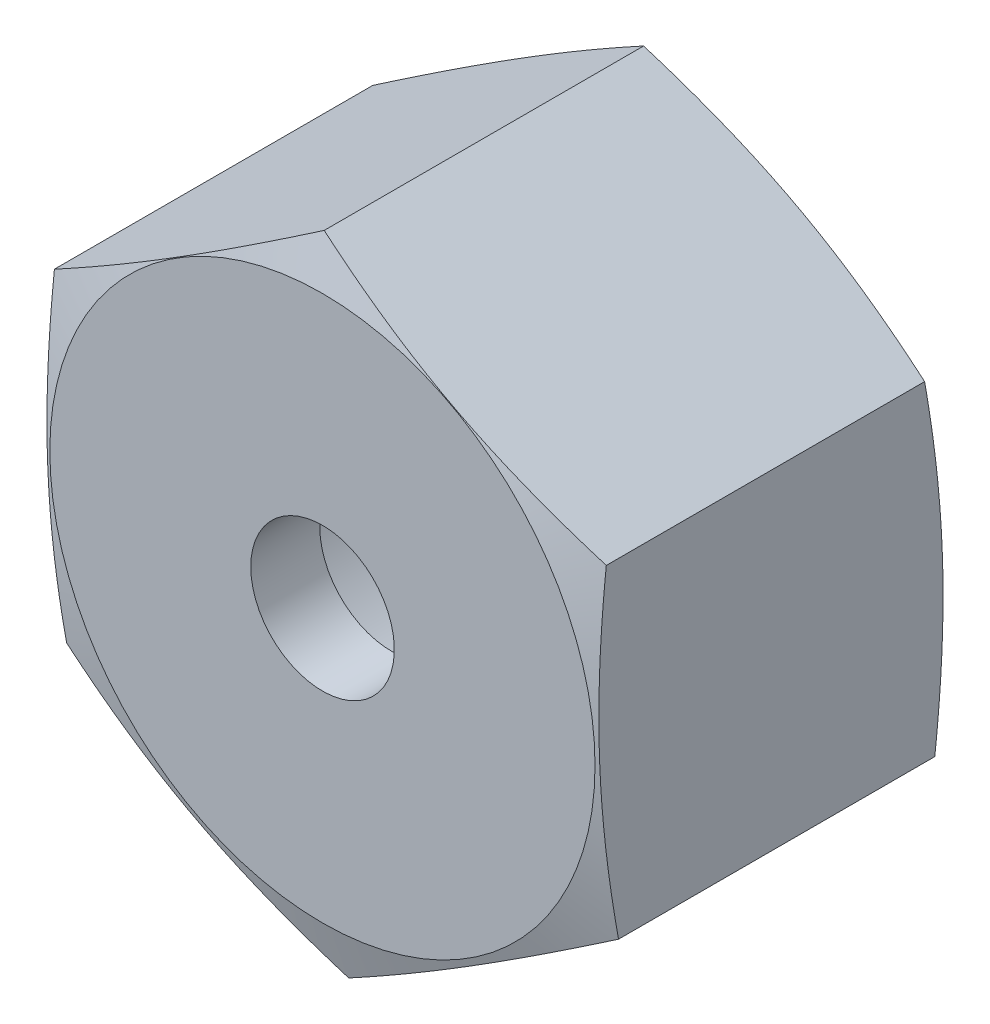
ISO-10303-21;
HEADER;
FILE_DESCRIPTION(('STEP AP214'),'2;1');
FILE_NAME('part.step','',(''),(''),'','','');
FILE_SCHEMA(('AUTOMOTIVE_DESIGN { 1 0 10303 214 1 1 1 1 }'));
ENDSEC;
DATA;
#1=APPLICATION_CONTEXT('core data for automotive mechanical design processes');
#2=APPLICATION_PROTOCOL_DEFINITION('international standard','automotive_design',2000,#1);
#3=PRODUCT_CONTEXT('',#1,'mechanical');
#4=PRODUCT('Part','Part','',(#3));
#5=PRODUCT_RELATED_PRODUCT_CATEGORY('part','',(#4));
#6=PRODUCT_DEFINITION_FORMATION('','',#4);
#7=PRODUCT_DEFINITION_CONTEXT('part definition',#1,'design');
#8=PRODUCT_DEFINITION('design','',#6,#7);
#9=PRODUCT_DEFINITION_SHAPE('','',#8);
#10=(LENGTH_UNIT() NAMED_UNIT(*) SI_UNIT(.MILLI.,.METRE.));
#11=(NAMED_UNIT(*) PLANE_ANGLE_UNIT() SI_UNIT($,.RADIAN.));
#12=(NAMED_UNIT(*) SI_UNIT($,.STERADIAN.) SOLID_ANGLE_UNIT());
#13=UNCERTAINTY_MEASURE_WITH_UNIT(LENGTH_MEASURE(1.E-05),#10,'distance_accuracy_value','');
#14=(GEOMETRIC_REPRESENTATION_CONTEXT(3) GLOBAL_UNCERTAINTY_ASSIGNED_CONTEXT((#13)) GLOBAL_UNIT_ASSIGNED_CONTEXT((#10,
#11,#12)) REPRESENTATION_CONTEXT('',''));
#15=CARTESIAN_POINT('',(0.,0.,0.));
#16=DIRECTION('',(0.,0.,1.));
#17=DIRECTION('',(1.,0.,0.));
#18=AXIS2_PLACEMENT_3D('',#15,#16,#17);
#19=CARTESIAN_POINT('',(-1.68437698196864,0.,-2.032));
#20=DIRECTION('',(0.,0.,1.));
#21=DIRECTION('',(1.,0.,0.));
#22=AXIS2_PLACEMENT_3D('',#19,#20,#21);
#23=PLANE('',#22);
#24=CARTESIAN_POINT('',(-1.68718582633648,0.0798447166311515,-2.03200000080983));
#25=DIRECTION('',(0.,0.,1.));
#26=DIRECTION('',(1.,0.,0.));
#27=AXIS2_PLACEMENT_3D('',#24,#25,#26);
#28=CIRCLE('',#27,6.26924252630839);
#29=CARTESIAN_POINT('',(4.58205669997191,0.0798447166311515,-2.03200000080983));
#30=VERTEX_POINT('',#29);
#31=EDGE_CURVE('E252',#30,#30,#28,.T.);
#32=ORIENTED_EDGE('',*,*,#31,.F.);
#33=EDGE_LOOP('',(#32));
#34=FACE_BOUND('',#33,.T.);
#35=CARTESIAN_POINT('',(-1.68437698196866,0.0799435285126994,-2.0319999999856));
#36=DIRECTION('',(0.,0.,-1.));
#37=DIRECTION('',(-1.,0.,0.));
#38=AXIS2_PLACEMENT_3D('',#35,#36,#37);
#39=CIRCLE('',#38,4.36562388905558);
#40=CARTESIAN_POINT('',(-6.05000087102424,0.0799435285126994,-2.0319999999856));
#41=VERTEX_POINT('',#40);
#42=EDGE_CURVE('E19',#41,#41,#39,.F.);
#43=ORIENTED_EDGE('',*,*,#42,.T.);
#44=EDGE_LOOP('',(#43));
#45=FACE_BOUND('',#44,.T.);
#46=ADVANCED_FACE('F16',(#34,#45),#23,.F.);
#47=CARTESIAN_POINT('',(-1.68437698196866,0.0799435285126994,-2.03199999987191));
#48=DIRECTION('',(0.,0.,-1.));
#49=DIRECTION('',(-1.,0.,0.));
#50=AXIS2_PLACEMENT_3D('',#47,#48,#49);
#51=CONICAL_SURFACE('',#50,4.36562388905204,0.0311192205274225);
#52=CARTESIAN_POINT('',(-1.68437698196866,0.0799435285126994,4.31800000001203));
#53=DIRECTION('',(0.,0.,-1.));
#54=DIRECTION('',(-1.,0.,0.));
#55=AXIS2_PLACEMENT_3D('',#52,#53,#54);
#56=CIRCLE('',#55,4.16795302604421);
#57=CARTESIAN_POINT('',(-5.85233000801287,0.0799435285126994,4.31800000001203));
#58=VERTEX_POINT('',#57);
#59=EDGE_CURVE('E78',#58,#58,#56,.F.);
#60=ORIENTED_EDGE('',*,*,#59,.T.);
#61=EDGE_LOOP('',(#60));
#62=FACE_BOUND('',#61,.T.);
#63=ORIENTED_EDGE('',*,*,#42,.F.);
#64=EDGE_LOOP('',(#63));
#65=FACE_BOUND('',#64,.T.);
#66=ADVANCED_FACE('F115',(#62,#65),#51,.F.);
#67=CARTESIAN_POINT('',(-1.68718582633648,0.0798447166311515,-1.68543793177971));
#68=DIRECTION('',(0.,0.,1.));
#69=DIRECTION('',(1.,0.,0.));
#70=AXIS2_PLACEMENT_3D('',#67,#68,#69);
#71=CONICAL_SURFACE('',#70,7.41910050189164,1.27805970982502);
#72=ORIENTED_EDGE('',*,*,#31,.T.);
#73=EDGE_LOOP('',(#72));
#74=FACE_BOUND('',#73,.T.);
#75=CARTESIAN_POINT('',(-7.90155935946617,-3.88715531238072,-1.6994469075203));
#76=CARTESIAN_POINT('',(-7.63283354902785,-4.02995052571652,-1.74457835599168));
#77=CARTESIAN_POINT('',(-7.36350025758161,-4.17306854161447,-1.78547486718036));
#78=CARTESIAN_POINT('',(-6.82365934852008,-4.45992858550493,-1.8571514041136));
#79=CARTESIAN_POINT('',(-6.55315121737776,-4.60367088637485,-1.88792643198343));
#80=CARTESIAN_POINT('',(-6.0129977336647,-4.8906970258256,-1.93750670168888));
#81=CARTESIAN_POINT('',(-5.74335791157891,-5.03397792562367,-1.95638716592702));
#82=CARTESIAN_POINT('',(-5.20367165362195,-5.32075579118734,-1.98130690017016));
#83=CARTESIAN_POINT('',(-4.9336253296936,-5.46425269746888,-1.98734922279734));
#84=CARTESIAN_POINT('',(-4.39357127680444,-5.75122600148232,-1.98618661366952));
#85=CARTESIAN_POINT('',(-4.12356354650853,-5.89470239992366,-1.97898245963108));
#86=CARTESIAN_POINT('',(-3.58399310901471,-6.18141872094228,-1.95181743046639));
#87=CARTESIAN_POINT('',(-3.31443052471405,-6.32465857821457,-1.93185348217872));
#88=CARTESIAN_POINT('',(-2.77445511938541,-6.61159009057738,-1.88023250615435));
#89=CARTESIAN_POINT('',(-2.50404799535492,-6.75527871840392,-1.84850103441643));
#90=CARTESIAN_POINT('',(-1.9644234843196,-7.04202377295909,-1.77506216021474));
#91=CARTESIAN_POINT('',(-1.69520556299217,-7.18508048361545,-1.73335983063426));
#92=CARTESIAN_POINT('',(-1.42659292703106,-7.3278155584272,-1.68750489218784));
#93=B_SPLINE_CURVE_WITH_KNOTS('',3,(#75,#76,#77,#78,#79,#80,#81,#82,#83,#84,#85,#86,#87,#88,#89,
#90,#91,#92),.UNSPECIFIED.,.F.,.F.,(4,2,2,2,2,2,2,2,4),(0.,0.922972352577497,1.84639977664712,
2.76392713133151,3.6812362941598,4.59849160238482,5.51596791232409,6.43935024626808,
7.36226378599791),.UNSPECIFIED.);
#94=CARTESIAN_POINT('',(-7.90155937083143,-3.88715531803328,-1.69944690371631));
#95=VERTEX_POINT('',#94);
#96=CARTESIAN_POINT('',(-1.42659292013279,-7.32781554548326,-1.68750489601358));
#97=VERTEX_POINT('',#96);
#98=EDGE_CURVE('E67',#95,#97,#93,.T.);
#99=ORIENTED_EDGE('',*,*,#98,.F.);
#100=CARTESIAN_POINT('',(-8.15934341944915,3.44066021570237,-1.72352556437557));
#101=CARTESIAN_POINT('',(-8.14952959511376,3.16169067502731,-1.76491009393961));
#102=CARTESIAN_POINT('',(-8.13969550949121,2.88214518334872,-1.80269976621289));
#103=CARTESIAN_POINT('',(-8.11998747006128,2.32192089977879,-1.86977662866314));
#104=CARTESIAN_POINT('',(-8.11011350081679,2.04124166906928,-1.89906012528652));
#105=CARTESIAN_POINT('',(-8.09039402036347,1.48069216090473,-1.9476279873357));
#106=CARTESIAN_POINT('',(-8.08054869221002,1.20082708701525,-1.96697111515974));
#107=CARTESIAN_POINT('',(-8.06084096145893,0.640611578005813,-1.99490953728493));
#108=CARTESIAN_POINT('',(-8.05097856263684,0.360261250210199,-2.00350696341941));
#109=CARTESIAN_POINT('',(-8.02947904241872,-0.250887989373537,-2.00997816083343));
#110=CARTESIAN_POINT('',(-8.01784101021843,-0.581712791848319,-2.00565094060494));
#111=CARTESIAN_POINT('',(-7.99458152320489,-1.24289116500385,-1.98167589316218));
#112=CARTESIAN_POINT('',(-7.98296007441884,-1.57324456435419,-1.96202346588683));
#113=CARTESIAN_POINT('',(-7.95967536988931,-2.23513977516758,-1.90869015486569));
#114=CARTESIAN_POINT('',(-7.94801240176889,-2.56667341060581,-1.87491081444704));
#115=CARTESIAN_POINT('',(-7.9247430873274,-3.22813114000049,-1.79551198601293));
#116=CARTESIAN_POINT('',(-7.91313671104761,-3.55805608556931,-1.74989966568228));
#117=CARTESIAN_POINT('',(-7.90155938228166,-3.88715532127048,-1.69944690028244));
#118=B_SPLINE_CURVE_WITH_KNOTS('',3,(#100,#101,#102,#103,#104,#105,#106,#107,#108,#109,#110,
#111,#112,#113,#114,#115,#116,#117),.UNSPECIFIED.,.F.,.F.,(4,2,2,2,2,2,2,2,4),(0.,
0.846620605291064,1.69360828271621,2.53552967614048,3.37728401475749,4.37007743763002,
5.36316897517593,6.36330028992103,7.36282719600865),.UNSPECIFIED.);
#119=CARTESIAN_POINT('',(-8.15934342946581,3.44066022663692,-1.72352556017752));
#120=VERTEX_POINT('',#119);
#121=EDGE_CURVE('E72',#120,#95,#118,.T.);
#122=ORIENTED_EDGE('',*,*,#121,.F.);
#123=CARTESIAN_POINT('',(-1.94216104827342,7.32781553126516,-1.73566435596546));
#124=CARTESIAN_POINT('',(-2.20015960700612,7.16650765894646,-1.78153587364533));
#125=CARTESIAN_POINT('',(-2.45875530949975,7.00482643574544,-1.82315780158227));
#126=CARTESIAN_POINT('',(-2.97711425861675,6.68073400829105,-1.89617166331872));
#127=CARTESIAN_POINT('',(-3.23687805291886,6.5183224616137,-1.92755814604306));
#128=CARTESIAN_POINT('',(-3.7555452380153,6.19403731645476,-1.97814939189274));
#129=CARTESIAN_POINT('',(-4.01444290103465,6.03216729913734,-1.99743360314278));
#130=CARTESIAN_POINT('',(-4.53264360780177,5.70817380919986,-2.02289162074818));
#131=CARTESIAN_POINT('',(-4.79194653040257,5.54605041232427,-2.02906879189925));
#132=CARTESIAN_POINT('',(-5.31051311427168,5.22182816584977,-2.02787988696628));
#133=CARTESIAN_POINT('',(-5.56977677698617,5.05972931534668,-2.02051466799499));
#134=CARTESIAN_POINT('',(-6.08786042295478,4.7358090150752,-1.99276419156467));
#135=CARTESIAN_POINT('',(-6.34668027327066,4.57398764842349,-1.9723755481482));
#136=CARTESIAN_POINT('',(-6.8651689349298,4.24981412108122,-1.91970918045817));
#137=CARTESIAN_POINT('',(-7.12483184950398,4.08746564721464,-1.88735286385999));
#138=CARTESIAN_POINT('',(-7.64297541569796,3.76350788315223,-1.81255721028964));
#139=CARTESIAN_POINT('',(-7.90145663656112,3.60189823704963,-1.77012340110358));
#140=CARTESIAN_POINT('',(-8.1593434371336,3.44066023904004,-1.72352555640376));
#141=B_SPLINE_CURVE_WITH_KNOTS('',3,(#123,#124,#125,#126,#127,#128,#129,#130,#131,#132,#133,
#134,#135,#136,#137,#138,#139,#140),.UNSPECIFIED.,.F.,.F.,(4,2,2,2,2,2,2,2,4),(0.,
0.923205923060257,1.84690271655818,2.76447045606288,3.68180261211819,4.59907671121201,
5.51658938933177,6.44023761207337,7.36338035344015),.UNSPECIFIED.);
#142=CARTESIAN_POINT('',(-1.94216104379231,7.32781554548516,-1.73566435172974));
#143=VERTEX_POINT('',#142);
#144=EDGE_CURVE('E91',#143,#120,#141,.T.);
#145=ORIENTED_EDGE('',*,*,#144,.F.);
#146=CARTESIAN_POINT('',(4.53280538900928,3.88715531584512,-1.72352556460324));
#147=CARTESIAN_POINT('',(4.26422578631773,4.02987283747592,-1.77012340881996));
#148=CARTESIAN_POINT('',(3.99502711678899,4.17291931813355,-1.81255721746609));
#149=CARTESIAN_POINT('',(3.45539968011829,4.4596659273095,-1.88735286985088));
#150=CARTESIAN_POINT('',(3.18497032013036,4.60336637085362,-1.91970918580347));
#151=CARTESIAN_POINT('',(2.64498347927062,4.89030395981586,-1.97237555211082));
#152=CARTESIAN_POINT('',(2.37543213966646,5.0335378418942,-1.99276419479079));
#153=CARTESIAN_POINT('',(1.83586710777074,5.3202512904923,-2.02051466969045));
#154=CARTESIAN_POINT('',(1.56585355392944,5.46373078344252,-2.02787988786757));
#155=CARTESIAN_POINT('',(1.0257855600824,5.75071149538619,-2.02906879120882));
#156=CARTESIAN_POINT('',(0.755731118570517,5.89421271517996,-2.02289161926135));
#157=CARTESIAN_POINT('',(0.216044172328692,6.18099094648365,-1.99743360011741));
#158=CARTESIAN_POINT('',(-0.0535882062311414,6.32426789094943,-1.97814938812522));
#159=CARTESIAN_POINT('',(-0.59376097242539,6.61130427670294,-1.92755814087997));
#160=CARTESIAN_POINT('',(-0.864295394793043,6.75506054817406,-1.89617165750276));
#161=CARTESIAN_POINT('',(-1.40414714454337,7.04192635257732,-1.8231577945663));
#162=CARTESIAN_POINT('',(-1.67346504231329,7.18503618860118,-1.78153586608228));
#163=CARTESIAN_POINT('',(-1.94216103685588,7.32781555840046,-1.73566434791303));
#164=B_SPLINE_CURVE_WITH_KNOTS('',3,(#146,#147,#148,#149,#150,#151,#152,#153,#154,#155,#156,
#157,#158,#159,#160,#161,#162,#163),.UNSPECIFIED.,.F.,.F.,(4,2,2,2,2,2,2,2,4),(0.,
0.923142741394493,1.84679096415454,2.7643036422957,3.6815777414127,4.59890989741348,
5.51647763686588,6.44017443031724,7.36338035332062),.UNSPECIFIED.);
#165=CARTESIAN_POINT('',(4.53280540365776,3.88715531909998,-1.72352556032553));
#166=VERTEX_POINT('',#165);
#167=EDGE_CURVE('E223',#166,#143,#164,.T.);
#168=ORIENTED_EDGE('',*,*,#167,.F.);
#169=CARTESIAN_POINT('',(4.79058945724615,-3.44066026500129,-1.69944690116646));
#170=CARTESIAN_POINT('',(4.78031260584605,-3.14852863346865,-1.74422013575479));
#171=CARTESIAN_POINT('',(4.77001347072849,-2.85576356096411,-1.78519292645876));
#172=CARTESIAN_POINT('',(4.74937050007161,-2.26896275370343,-1.85801444510759));
#173=CARTESIAN_POINT('',(4.73902664490218,-1.97492646093851,-1.8898586394457));
#174=CARTESIAN_POINT('',(4.71836925199411,-1.38771568416413,-1.94268623497041));
#175=CARTESIAN_POINT('',(4.70805593068054,-1.09454735229331,-1.96373646759316));
#176=CARTESIAN_POINT('',(4.68740994639005,-0.507660878940168,-1.99407376390573));
#177=CARTESIAN_POINT('',(4.67707728833392,-0.213942877337304,-2.00336349616493));
#178=CARTESIAN_POINT('',(4.65557727678348,0.397220328947984,-2.00983876660971));
#179=CARTESIAN_POINT('',(4.64440951438188,0.714677157302555,-2.00599258162228));
#180=CARTESIAN_POINT('',(4.62208850343178,1.34917824060594,-1.98416617342515));
#181=CARTESIAN_POINT('',(4.61093525951781,1.66622236381264,-1.96618220212484));
#182=CARTESIAN_POINT('',(4.58858916989264,2.30143633805705,-1.9171674564592));
#183=CARTESIAN_POINT('',(4.57739656926123,2.61959922241249,-1.88604895025559));
#184=CARTESIAN_POINT('',(4.55506224004874,3.25447889304448,-1.81266833902831));
#185=CARTESIAN_POINT('',(4.54392048764423,3.57119635653065,-1.77041215036108));
#186=CARTESIAN_POINT('',(4.53280541835647,3.88715532092711,-1.72352555625957));
#187=B_SPLINE_CURVE_WITH_KNOTS('',3,(#169,#170,#171,#172,#173,#174,#175,#176,#177,#178,#179,
#180,#181,#182,#183,#184,#185,#186),.UNSPECIFIED.,.F.,.F.,(4,2,2,2,2,2,2,2,4),(0.,
0.887216241048523,1.77487234692872,2.65696402413229,3.53885551044887,4.49155350115021,
5.44450414831569,6.40392333407524,7.36283389822678),.UNSPECIFIED.);
#188=CARTESIAN_POINT('',(4.79058945258603,-3.44066025992053,-1.69944690313175));
#189=VERTEX_POINT('',#188);
#190=EDGE_CURVE('E134',#189,#166,#187,.T.);
#191=ORIENTED_EDGE('',*,*,#190,.F.);
#192=CARTESIAN_POINT('',(-1.42659291564943,-7.32781553125609,-1.68750490025143));
#193=CARTESIAN_POINT('',(-1.16867439807883,-7.16655770289741,-1.73335983798926));
#194=CARTESIAN_POINT('',(-0.910174693017654,-7.00493649996027,-1.77506216684818));
#195=CARTESIAN_POINT('',(-0.392033938291426,-6.68098049370567,-1.84850103961289));
#196=CARTESIAN_POINT('',(-0.132392375576461,-6.51864536961514,-1.88023251063555));
#197=CARTESIAN_POINT('',(0.386085303475168,-6.19447870890445,-1.93185348527587));
#198=CARTESIAN_POINT('',(0.644915949625742,-6.03265059239672,-1.95181743289383));
#199=CARTESIAN_POINT('',(1.16300478356841,-5.70872704845962,-1.97898246080442));
#200=CARTESIAN_POINT('',(1.42226285335608,-5.54663169480988,-1.98618661425838));
#201=CARTESIAN_POINT('',(1.94081604874285,-5.2224178191868,-1.98734922234552));
#202=CARTESIAN_POINT('',(2.20011117562388,-5.06029929641195,-1.98130689926285));
#203=CARTESIAN_POINT('',(2.71831121883732,-4.73630622134669,-1.95638716426476));
#204=CARTESIAN_POINT('',(2.97721602768363,-4.57443173625957,-1.93750669972723));
#205=CARTESIAN_POINT('',(3.49586469523566,-4.25015816878425,-1.88792642958165));
#206=CARTESIAN_POINT('',(3.75560324363843,-4.08776240654512,-1.85715140157269));
#207=CARTESIAN_POINT('',(4.27395178087667,-3.76367648888681,-1.78547486450328));
#208=CARTESIAN_POINT('',(4.53256226279443,-3.6019860251789,-1.74457835331748));
#209=CARTESIAN_POINT('',(4.7905894489958,-3.44066025417083,-1.69944690490998));
#210=B_SPLINE_CURVE_WITH_KNOTS('',3,(#192,#193,#194,#195,#196,#197,#198,#199,#200,#201,#202,
#203,#204,#205,#206,#207,#208,#209),.UNSPECIFIED.,.F.,.F.,(4,2,2,2,2,2,2,2,4),(0.,
0.922913535185095,1.84629586456834,2.76377217002815,3.68102747377968,4.59833663208566,
5.51586398224429,6.43929140171229,7.36226374969175),.UNSPECIFIED.);
#211=EDGE_CURVE('E74',#97,#189,#210,.T.);
#212=ORIENTED_EDGE('',*,*,#211,.F.);
#213=EDGE_LOOP('',(#99,#122,#145,#168,#191,#212));
#214=FACE_BOUND('',#213,.T.);
#215=ADVANCED_FACE('F69',(#74,#214),#71,.T.);
#216=CARTESIAN_POINT('',(-1.68437698196866,0.0799435285126994,4.318));
#217=DIRECTION('',(0.,0.,1.));
#218=DIRECTION('',(1.,0.,0.));
#219=AXIS2_PLACEMENT_3D('',#216,#217,#218);
#220=PLANE('',#219);
#221=ORIENTED_EDGE('',*,*,#59,.F.);
#222=EDGE_LOOP('',(#221));
#223=FACE_BOUND('',#222,.T.);
#224=CARTESIAN_POINT('',(-1.68437698196866,0.0799435285127248,4.318));
#225=DIRECTION('',(0.,0.,-1.));
#226=DIRECTION('',(-1.,0.,0.));
#227=AXIS2_PLACEMENT_3D('',#224,#225,#226);
#228=CIRCLE('',#227,1.651);
#229=CARTESIAN_POINT('',(-3.33537698196866,0.0799435285127248,4.318));
#230=VERTEX_POINT('',#229);
#231=EDGE_CURVE('E87',#230,#230,#228,.F.);
#232=ORIENTED_EDGE('',*,*,#231,.T.);
#233=EDGE_LOOP('',(#232));
#234=FACE_BOUND('',#233,.T.);
#235=ADVANCED_FACE('F114',(#223,#234),#220,.F.);
#236=CARTESIAN_POINT('',(-1.42659294437056,-7.32781554921335,-2.032));
#237=DIRECTION('',(-0.469243965627421,-0.883068570792921,0.));
#238=DIRECTION('',(0.883068570792921,-0.469243965627421,0.));
#239=AXIS2_PLACEMENT_3D('',#236,#237,#238);
#240=PLANE('',#239);
#241=ORIENTED_EDGE('',*,*,#98,.T.);
#242=DIRECTION('',(0.,0.,1.));
#243=VECTOR('',#242,1.);
#244=CARTESIAN_POINT('',(-1.42659294431277,-7.32781554917721,-2.032));
#245=LINE('',#244,#243);
#246=CARTESIAN_POINT('',(-1.42659296326114,-7.32781556102425,5.56100489180933));
#247=VERTEX_POINT('',#246);
#248=EDGE_CURVE('E77',#247,#97,#245,.F.);
#249=ORIENTED_EDGE('',*,*,#248,.F.);
#250=CARTESIAN_POINT('',(-7.90155939897513,-3.88715524416849,5.572946865015));
#251=CARTESIAN_POINT('',(-7.63283360487362,-4.02995047908484,5.61807833440999));
#252=CARTESIAN_POINT('',(-7.36350032095472,-4.17306850339582,5.65897485455034));
#253=CARTESIAN_POINT('',(-6.82365941932336,-4.45992855242733,5.73065139894935));
#254=CARTESIAN_POINT('',(-6.55315128808062,-4.60367085001925,5.76142642533377));
#255=CARTESIAN_POINT('',(-6.01299780642383,-4.89069698595629,5.81100669517912));
#256=CARTESIAN_POINT('',(-5.74335798648212,-5.0339778854984,5.82988716103079));
#257=CARTESIAN_POINT('',(-5.20367173215623,-5.32075574977909,5.85480689798305));
#258=CARTESIAN_POINT('',(-4.9336254097149,-5.46425265503388,5.86084922170281));
#259=CARTESIAN_POINT('',(-4.3935713601611,-5.75122595710172,5.85968661511642));
#260=CARTESIAN_POINT('',(-4.1235636317135,-5.89470235462421,5.85248246253983));
#261=CARTESIAN_POINT('',(-3.58399319787166,-6.18141867374891,5.82531743632594));
#262=CARTESIAN_POINT('',(-3.31443061537458,-6.32465853004617,5.80535348952956));
#263=CARTESIAN_POINT('',(-2.77445521347005,-6.61159004057607,5.75373251648539));
#264=CARTESIAN_POINT('',(-2.50404809106041,-6.75527866754468,5.72200104622951));
#265=CARTESIAN_POINT('',(-1.96442358316256,-7.04202372043939,5.64856217490534));
#266=CARTESIAN_POINT('',(-1.69520566335205,-7.18508043029306,5.60685984671753));
#267=CARTESIAN_POINT('',(-1.426593028898,-7.32781550429726,5.56100490959153));
#268=B_SPLINE_CURVE_WITH_KNOTS('',3,(#250,#251,#252,#253,#254,#255,#256,#257,#258,#259,#260,
#261,#262,#263,#264,#265,#266,#267),.UNSPECIFIED.,.F.,.F.,(4,2,2,2,2,2,2,2,4),(0.,
0.922972348105797,1.84639976719056,2.76392711628187,3.68123627374337,4.59849157570065,
5.51596787920347,6.43935020721507,7.36226374127635),.UNSPECIFIED.);
#269=CARTESIAN_POINT('',(-7.90155940245727,-3.88715530122798,5.57294689842632));
#270=VERTEX_POINT('',#269);
#271=EDGE_CURVE('E85',#270,#247,#268,.T.);
#272=ORIENTED_EDGE('',*,*,#271,.F.);
#273=DIRECTION('',(0.,0.,1.));
#274=VECTOR('',#273,1.);
#275=CARTESIAN_POINT('',(-7.90155938219669,-3.88715532368585,-2.032));
#276=LINE('',#275,#274);
#277=EDGE_CURVE('E82',#95,#270,#276,.T.);
#278=ORIENTED_EDGE('',*,*,#277,.F.);
#279=EDGE_LOOP('',(#241,#249,#272,#278));
#280=FACE_BOUND('',#279,.T.);
#281=ADVANCED_FACE('F83',(#280),#240,.T.);
#282=CARTESIAN_POINT('',(4.79058945669578,-3.4406602493566,-2.032));
#283=DIRECTION('',(0.530137832776576,-0.847911480202359,0.));
#284=DIRECTION('',(0.847911480202359,0.530137832776576,0.));
#285=AXIS2_PLACEMENT_3D('',#282,#283,#284);
#286=PLANE('',#285);
#287=ORIENTED_EDGE('',*,*,#211,.T.);
#288=DIRECTION('',(0.,0.,1.));
#289=VECTOR('',#288,1.);
#290=CARTESIAN_POINT('',(4.79058945669462,-3.44066024932339,-2.032));
#291=LINE('',#290,#289);
#292=CARTESIAN_POINT('',(4.79058945747539,-3.44066027151766,5.57294690018699));
#293=VERTEX_POINT('',#292);
#294=EDGE_CURVE('E133',#293,#189,#291,.F.);
#295=ORIENTED_EDGE('',*,*,#294,.F.);
#296=CARTESIAN_POINT('',(-1.42659300012878,-7.32781553518406,5.56100485668621));
#297=CARTESIAN_POINT('',(-1.16867447088048,-7.16655773085775,5.60685981552664));
#298=CARTESIAN_POINT('',(-0.910174761065001,-7.00493653780081,5.64856215353684));
#299=CARTESIAN_POINT('',(-0.392034003062428,-6.68098053890925,5.72200103412155));
#300=CARTESIAN_POINT('',(-0.132392441829059,-6.51864541229557,5.75373250381299));
#301=CARTESIAN_POINT('',(0.386085235737883,-6.19447875000627,5.80535347876718));
#302=CARTESIAN_POINT('',(0.644915881874135,-6.03265063442216,5.8253174280196));
#303=CARTESIAN_POINT('',(1.16300471545163,-5.70872709138279,5.85248245855676));
#304=CARTESIAN_POINT('',(1.42226278488866,-5.54663173770732,5.85968661299993));
#305=CARTESIAN_POINT('',(1.94081597947763,-5.22241786240362,5.86084922329584));
#306=CARTESIAN_POINT('',(2.20011110591148,-5.06029933997392,5.85480690144584));
#307=CARTESIAN_POINT('',(2.71831114819477,-4.73630626553854,5.82988716883563));
#308=CARTESIAN_POINT('',(2.97721595655818,-4.5744317807361,5.81100670545557));
#309=CARTESIAN_POINT('',(3.49586462334458,-4.25015821372559,5.76142643754267));
#310=CARTESIAN_POINT('',(3.75560317146432,-4.08776245166689,5.73065141060092));
#311=CARTESIAN_POINT('',(4.27395170822159,-3.76367653431627,5.65897487552762));
#312=CARTESIAN_POINT('',(4.53256218994112,-3.60198607073577,5.61807836526802));
#313=CARTESIAN_POINT('',(4.79058937594,-3.44066029984735,5.5729469177015));
#314=B_SPLINE_CURVE_WITH_KNOTS('',3,(#296,#297,#298,#299,#300,#301,#302,#303,#304,#305,#306,
#307,#308,#309,#310,#311,#312,#313),.UNSPECIFIED.,.F.,.F.,(4,2,2,2,2,2,2,2,4),(0.,
0.922913535301736,1.84629586430502,2.76377216871366,3.68102747163319,4.5983366282001,
5.51586397645701,6.43929139460019,7.362263741507),.UNSPECIFIED.);
#315=EDGE_CURVE('E150',#247,#293,#314,.T.);
#316=ORIENTED_EDGE('',*,*,#315,.F.);
#317=ORIENTED_EDGE('',*,*,#248,.T.);
#318=EDGE_LOOP('',(#287,#295,#316,#317));
#319=FACE_BOUND('',#318,.T.);
#320=ADVANCED_FACE('F140',(#319),#286,.T.);
#321=CARTESIAN_POINT('',(4.5328054190977,3.88715529985676,-2.032));
#322=DIRECTION('',(0.999381798403997,0.035157090590562,0.));
#323=DIRECTION('',(-0.035157090590562,0.999381798403997,0.));
#324=AXIS2_PLACEMENT_3D('',#321,#322,#323);
#325=PLANE('',#324);
#326=ORIENTED_EDGE('',*,*,#190,.T.);
#327=DIRECTION('',(0.,0.,1.));
#328=VECTOR('',#327,1.);
#329=CARTESIAN_POINT('',(4.53280541904918,3.88715529988255,-2.032));
#330=LINE('',#329,#328);
#331=CARTESIAN_POINT('',(4.53280543866814,3.88715528945745,5.59702555600745));
#332=VERTEX_POINT('',#331);
#333=EDGE_CURVE('E229',#332,#166,#330,.F.);
#334=ORIENTED_EDGE('',*,*,#333,.F.);
#335=CARTESIAN_POINT('',(4.79058941686891,-3.4406602903215,5.57294686515894));
#336=CARTESIAN_POINT('',(4.78031259189433,-3.14852865815112,5.6177201206945));
#337=CARTESIAN_POINT('',(4.77001346756355,-2.85576358388155,5.65869292032478));
#338=CARTESIAN_POINT('',(4.74937050469684,-2.26896277224083,5.73151444612042));
#339=CARTESIAN_POINT('',(4.73902664652399,-1.97492647686102,5.76335863867863));
#340=CARTESIAN_POINT('',(4.71836925133186,-1.38771569532935,5.81618623331442));
#341=CARTESIAN_POINT('',(4.70805593071453,-1.0945473613153,5.83723646681903));
#342=CARTESIAN_POINT('',(4.6874099468346,-0.507660883522975,5.86757376397817));
#343=CARTESIAN_POINT('',(4.67707728849302,-0.21394287962402,5.87686349619949));
#344=CARTESIAN_POINT('',(4.65557727704325,0.397220319148035,5.88333876644038));
#345=CARTESIAN_POINT('',(4.6444095150491,0.714677137685437,5.87949258184472));
#346=CARTESIAN_POINT('',(4.6220885048359,1.34917820134276,5.85766617522836));
#347=CARTESIAN_POINT('',(4.61093526125136,1.66622231472069,5.83968220512018));
#348=CARTESIAN_POINT('',(4.58858917229878,2.30143626947175,5.79066746255634));
#349=CARTESIAN_POINT('',(4.57739657201066,2.61959914416274,5.7595489582615));
#350=CARTESIAN_POINT('',(4.55506224347758,3.25447879566955,5.68616835134488));
#351=CARTESIAN_POINT('',(4.54392049140919,3.57119624969451,5.64391216507559));
#352=CARTESIAN_POINT('',(4.53280542244596,3.88715520467839,5.59702557351748));
#353=B_SPLINE_CURVE_WITH_KNOTS('',3,(#335,#336,#337,#338,#339,#340,#341,#342,#343,#344,#345,
#346,#347,#348,#349,#350,#351,#352),.UNSPECIFIED.,.F.,.F.,(4,2,2,2,2,2,2,2,4),(0.,
0.887216248846697,1.77487236205359,2.65696404589773,3.53885553906326,4.49155350033056,
5.44450411785593,6.40392327419992,7.36283380926758),.UNSPECIFIED.);
#354=EDGE_CURVE('E158',#293,#332,#353,.T.);
#355=ORIENTED_EDGE('',*,*,#354,.F.);
#356=ORIENTED_EDGE('',*,*,#294,.T.);
#357=EDGE_LOOP('',(#326,#334,#355,#356));
#358=FACE_BOUND('',#357,.T.);
#359=ADVANCED_FACE('F143',(#358),#325,.T.);
#360=CARTESIAN_POINT('',(-1.94216101956674,7.32781554921338,-2.032));
#361=DIRECTION('',(0.469243965627421,0.883068570792921,0.));
#362=DIRECTION('',(-0.883068570792921,0.469243965627421,0.));
#363=AXIS2_PLACEMENT_3D('',#360,#361,#362);
#364=PLANE('',#363);
#365=ORIENTED_EDGE('',*,*,#167,.T.);
#366=DIRECTION('',(0.,0.,1.));
#367=VECTOR('',#366,1.);
#368=CARTESIAN_POINT('',(-1.9421610196086,7.3278155491872,-2.032));
#369=LINE('',#368,#367);
#370=CARTESIAN_POINT('',(-1.94216100066141,7.32781556103351,5.60916434752017));
#371=VERTEX_POINT('',#370);
#372=EDGE_CURVE('E228',#371,#143,#369,.F.);
#373=ORIENTED_EDGE('',*,*,#372,.F.);
#374=CARTESIAN_POINT('',(4.53280543465472,3.88715524488303,5.59702552097472));
#375=CARTESIAN_POINT('',(4.26422584799087,4.02987278793092,5.64362338602852));
#376=CARTESIAN_POINT('',(3.99502718571943,4.17291927701087,5.68605720364456));
#377=CARTESIAN_POINT('',(3.45539975597008,4.45966589150042,5.76085286362278));
#378=CARTESIAN_POINT('',(3.18497039564255,4.60336633192927,5.79320917819875));
#379=CARTESIAN_POINT('',(2.64498355635146,4.89030391766349,5.84587554483623));
#380=CARTESIAN_POINT('',(2.37543221864253,5.03353779960828,5.86626418921058));
#381=CARTESIAN_POINT('',(1.83586718988005,5.32025124718076,5.89401466698228));
#382=CARTESIAN_POINT('',(1.56585363727678,5.46373073923918,5.90137988633402));
#383=CARTESIAN_POINT('',(1.02578564626054,5.75071144950726,5.9025687923644));
#384=CARTESIAN_POINT('',(0.75573120634147,5.89421266851726,5.89639162194466));
#385=CARTESIAN_POINT('',(0.216044263237981,6.18099089819946,5.87093360586213));
#386=CARTESIAN_POINT('',(-0.0535881137764396,6.32426784182757,5.85164939540602));
#387=CARTESIAN_POINT('',(-0.593760877067911,6.61130422602534,5.80105815120431));
#388=CARTESIAN_POINT('',(-0.864295298077898,6.75506049677835,5.7696716693272));
#389=CARTESIAN_POINT('',(-1.40414704521784,7.04192629980116,5.69665780927736));
#390=CARTESIAN_POINT('',(-1.67346494173471,7.18503613516249,5.65503588217696));
#391=CARTESIAN_POINT('',(-1.9421609350328,7.32781550429383,5.6091643653061));
#392=B_SPLINE_CURVE_WITH_KNOTS('',3,(#374,#375,#376,#377,#378,#379,#380,#381,#382,#383,#384,
#385,#386,#387,#388,#389,#390,#391),.UNSPECIFIED.,.F.,.F.,(4,2,2,2,2,2,2,2,4),(0.,
0.923142737789786,1.84679095643977,2.7643036298587,3.68157772447897,4.59890987508874,
5.51647760897995,6.44017439738642,7.36338031561321),.UNSPECIFIED.);
#393=EDGE_CURVE('E210',#332,#371,#392,.T.);
#394=ORIENTED_EDGE('',*,*,#393,.F.);
#395=ORIENTED_EDGE('',*,*,#333,.T.);
#396=EDGE_LOOP('',(#365,#373,#394,#395));
#397=FACE_BOUND('',#396,.T.);
#398=ADVANCED_FACE('F217',(#397),#364,.T.);
#399=CARTESIAN_POINT('',(-8.15934342063307,3.44066024935662,-2.032));
#400=DIRECTION('',(-0.530137832776577,0.847911480202358,0.));
#401=DIRECTION('',(-0.847911480202358,-0.530137832776577,0.));
#402=AXIS2_PLACEMENT_3D('',#399,#400,#401);
#403=PLANE('',#402);
#404=ORIENTED_EDGE('',*,*,#144,.T.);
#405=DIRECTION('',(0.,0.,1.));
#406=VECTOR('',#405,1.);
#407=CARTESIAN_POINT('',(-8.1593434206312,3.4406602493034,-2.032));
#408=LINE('',#407,#406);
#409=CARTESIAN_POINT('',(-8.15934342142167,3.44066027177358,5.59702555607736));
#410=VERTEX_POINT('',#409);
#411=EDGE_CURVE('E34',#410,#120,#408,.F.);
#412=ORIENTED_EDGE('',*,*,#411,.F.);
#413=CARTESIAN_POINT('',(-1.94216096379443,7.32781553519148,5.60916431239633));
#414=CARTESIAN_POINT('',(-2.20015953315965,7.16650768755952,5.65503585100863));
#415=CARTESIAN_POINT('',(-2.45875523935316,7.00482647489833,5.69665778796491));
#416=CARTESIAN_POINT('',(-2.97711418962265,6.6807340561353,5.76967165735301));
#417=CARTESIAN_POINT('',(-3.23687798137355,6.51832250760321,5.80105813870981));
#418=CARTESIAN_POINT('',(-3.75554516285627,6.19403736219724,5.85164938491836));
#419=CARTESIAN_POINT('',(-4.01444282480151,6.03216734646577,5.87093359788268));
#420=CARTESIAN_POINT('',(-4.53264352909038,5.70817385874698,5.8963916183922));
#421=CARTESIAN_POINT('',(-4.79194645028727,5.54605046250426,5.90256879073001));
#422=CARTESIAN_POINT('',(-5.3105130312643,5.22182821765862,5.90137988850472));
#423=CARTESIAN_POINT('',(-5.56977669249063,5.05972936815149,5.89401467106766));
#424=CARTESIAN_POINT('',(-6.08786033545878,4.73580906980429,5.86626419770433));
#425=CARTESIAN_POINT('',(-6.34668018426246,4.57398770408082,5.84587555582302));
#426=CARTESIAN_POINT('',(-6.86516884309557,4.24981417849157,5.79320919116892));
#427=CARTESIAN_POINT('',(-7.12483175635571,4.08746570545005,5.76085287606411));
#428=CARTESIAN_POINT('',(-7.64297532002075,3.76350794297577,5.68605722536472));
#429=CARTESIAN_POINT('',(-7.90145653966871,3.60189829763642,5.64362341755341));
#430=CARTESIAN_POINT('',(-8.15934333902488,3.44066030038034,5.5970255741437));
#431=B_SPLINE_CURVE_WITH_KNOTS('',3,(#413,#414,#415,#416,#417,#418,#419,#420,#421,#422,#423,
#424,#425,#426,#427,#428,#429,#430),.UNSPECIFIED.,.F.,.F.,(4,2,2,2,2,2,2,2,4),(0.,
0.923205919420281,1.84690270876498,2.76447044348812,3.6818025949898,4.59907668862823,
5.51658936112177,6.44023757876104,7.36338031529304),.UNSPECIFIED.);
#432=EDGE_CURVE('E197',#371,#410,#431,.T.);
#433=ORIENTED_EDGE('',*,*,#432,.F.);
#434=ORIENTED_EDGE('',*,*,#372,.T.);
#435=EDGE_LOOP('',(#404,#412,#433,#434));
#436=FACE_BOUND('',#435,.T.);
#437=ADVANCED_FACE('F184',(#436),#403,.T.);
#438=CARTESIAN_POINT('',(-7.90155938303497,-3.88715529985673,-2.032));
#439=DIRECTION('',(-0.999381798403997,-0.035157090590563,0.));
#440=DIRECTION('',(0.035157090590563,-0.999381798403997,0.));
#441=AXIS2_PLACEMENT_3D('',#438,#439,#440);
#442=PLANE('',#441);
#443=ORIENTED_EDGE('',*,*,#121,.T.);
#444=ORIENTED_EDGE('',*,*,#277,.T.);
#445=CARTESIAN_POINT('',(-8.15934338039041,3.4406602909849,5.59702552085081));
#446=CARTESIAN_POINT('',(-8.14952958261444,3.16169074547851,5.6384100725612));
#447=CARTESIAN_POINT('',(-8.13969550774769,2.88214524787219,5.67619975479293));
#448=CARTESIAN_POINT('',(-8.1199874758993,2.32192095159674,5.74327662617347));
#449=CARTESIAN_POINT('',(-8.11011350347453,2.04124171410954,5.77256012176849));
#450=CARTESIAN_POINT('',(-8.09039402042122,1.48069219287281,5.82112798419242));
#451=CARTESIAN_POINT('',(-8.08054869282576,1.2008271126884,5.84047111341341));
#452=CARTESIAN_POINT('',(-8.06084096220068,0.640611590922387,5.86840953710805));
#453=CARTESIAN_POINT('',(-8.05097856294678,0.360261256665017,5.87700696341273));
#454=CARTESIAN_POINT('',(-8.02947904267062,-0.250887979434676,5.8834781606534));
#455=CARTESIAN_POINT('',(-8.01784101089207,-0.58171277195117,5.87915094084804));
#456=CARTESIAN_POINT('',(-7.99458152463232,-1.242891125176,5.85517589508537));
#457=CARTESIAN_POINT('',(-7.9829600761783,-1.57324451455407,5.83552346907068));
#458=CARTESIAN_POINT('',(-7.95967537232795,-2.23513970563047,5.78219016131148));
#459=CARTESIAN_POINT('',(-7.94801240455484,-2.56667333130404,5.74841082289172));
#460=CARTESIAN_POINT('',(-7.92474309080008,-3.22813104139344,5.66901199894829));
#461=CARTESIAN_POINT('',(-7.91313671485974,-3.55805597742108,5.62339968110482));
#462=CARTESIAN_POINT('',(-7.9015593864201,-3.88715520363052,5.57294691832812));
#463=B_SPLINE_CURVE_WITH_KNOTS('',3,(#445,#446,#447,#448,#449,#450,#451,#452,#453,#454,#455,
#456,#457,#458,#459,#460,#461,#462),.UNSPECIFIED.,.F.,.F.,(4,2,2,2,2,2,2,2,4),(0.,
0.846620625750077,1.69360832319045,2.53552973577816,3.37728409375494,4.37007748677378,
5.36316899423329,6.36330027922529,7.36282715593991),.UNSPECIFIED.);
#464=EDGE_CURVE('E195',#410,#270,#463,.T.);
#465=ORIENTED_EDGE('',*,*,#464,.F.);
#466=ORIENTED_EDGE('',*,*,#411,.T.);
#467=EDGE_LOOP('',(#443,#444,#465,#466));
#468=FACE_BOUND('',#467,.T.);
#469=ADVANCED_FACE('F89',(#468),#442,.T.);
#470=CARTESIAN_POINT('',(-1.68437698196866,0.0799435285127248,5.9055));
#471=DIRECTION('',(0.,0.,-1.));
#472=DIRECTION('',(-1.,0.,0.));
#473=AXIS2_PLACEMENT_3D('',#470,#471,#472);
#474=CYLINDRICAL_SURFACE('',#473,1.651);
#475=ORIENTED_EDGE('',*,*,#231,.F.);
#476=EDGE_LOOP('',(#475));
#477=FACE_BOUND('',#476,.T.);
#478=CARTESIAN_POINT('',(-1.68437698196866,0.0799435285127248,5.9055));
#479=DIRECTION('',(0.,0.,-1.));
#480=DIRECTION('',(-1.,0.,0.));
#481=AXIS2_PLACEMENT_3D('',#478,#479,#480);
#482=CIRCLE('',#481,1.651);
#483=CARTESIAN_POINT('',(-3.33537698196866,0.0799435285127248,5.9055));
#484=VERTEX_POINT('',#483);
#485=EDGE_CURVE('E25',#484,#484,#482,.T.);
#486=ORIENTED_EDGE('',*,*,#485,.F.);
#487=EDGE_LOOP('',(#486));
#488=FACE_BOUND('',#487,.T.);
#489=ADVANCED_FACE('F173',(#477,#488),#474,.F.);
#490=CARTESIAN_POINT('',(-1.68718582633651,0.0798447166311519,5.59517471276144));
#491=DIRECTION('',(0.,0.,-1.));
#492=DIRECTION('',(-1.,0.,0.));
#493=AXIS2_PLACEMENT_3D('',#490,#491,#492);
#494=CONICAL_SURFACE('',#493,7.29887051908465,1.27805970984304);
#495=ORIENTED_EDGE('',*,*,#315,.T.);
#496=ORIENTED_EDGE('',*,*,#354,.T.);
#497=ORIENTED_EDGE('',*,*,#393,.T.);
#498=ORIENTED_EDGE('',*,*,#432,.T.);
#499=ORIENTED_EDGE('',*,*,#464,.T.);
#500=ORIENTED_EDGE('',*,*,#271,.T.);
#501=EDGE_LOOP('',(#495,#496,#497,#498,#499,#500));
#502=FACE_BOUND('',#501,.T.);
#503=CARTESIAN_POINT('',(-1.68718582633651,0.0798447166311519,5.90550000080725));
#504=DIRECTION('',(0.,0.,-1.));
#505=DIRECTION('',(-1.,0.,0.));
#506=AXIS2_PLACEMENT_3D('',#503,#504,#505);
#507=CIRCLE('',#506,6.26924252630826);
#508=CARTESIAN_POINT('',(-7.95642835264477,0.0798447166311519,5.90550000080725));
#509=VERTEX_POINT('',#508);
#510=EDGE_CURVE('E11',#509,#509,#507,.F.);
#511=ORIENTED_EDGE('',*,*,#510,.F.);
#512=EDGE_LOOP('',(#511));
#513=FACE_BOUND('',#512,.T.);
#514=ADVANCED_FACE('F170',(#502,#513),#494,.T.);
#515=CARTESIAN_POINT('',(-1.68437698196864,0.,5.9055));
#516=DIRECTION('',(0.,0.,1.));
#517=DIRECTION('',(1.,0.,0.));
#518=AXIS2_PLACEMENT_3D('',#515,#516,#517);
#519=PLANE('',#518);
#520=ORIENTED_EDGE('',*,*,#510,.T.);
#521=EDGE_LOOP('',(#520));
#522=FACE_BOUND('',#521,.T.);
#523=ORIENTED_EDGE('',*,*,#485,.T.);
#524=EDGE_LOOP('',(#523));
#525=FACE_BOUND('',#524,.T.);
#526=ADVANCED_FACE('F182',(#522,#525),#519,.T.);
#527=CLOSED_SHELL('',(#46,#66,#215,#235,#281,#320,#359,#398,#437,#469,#489,#514,#526));
#528=MANIFOLD_SOLID_BREP('B1',#527);
#529=ADVANCED_BREP_SHAPE_REPRESENTATION('',(#18,#528),#14);
#530=SHAPE_DEFINITION_REPRESENTATION(#9,#529);
ENDSEC;
END-ISO-10303-21;
